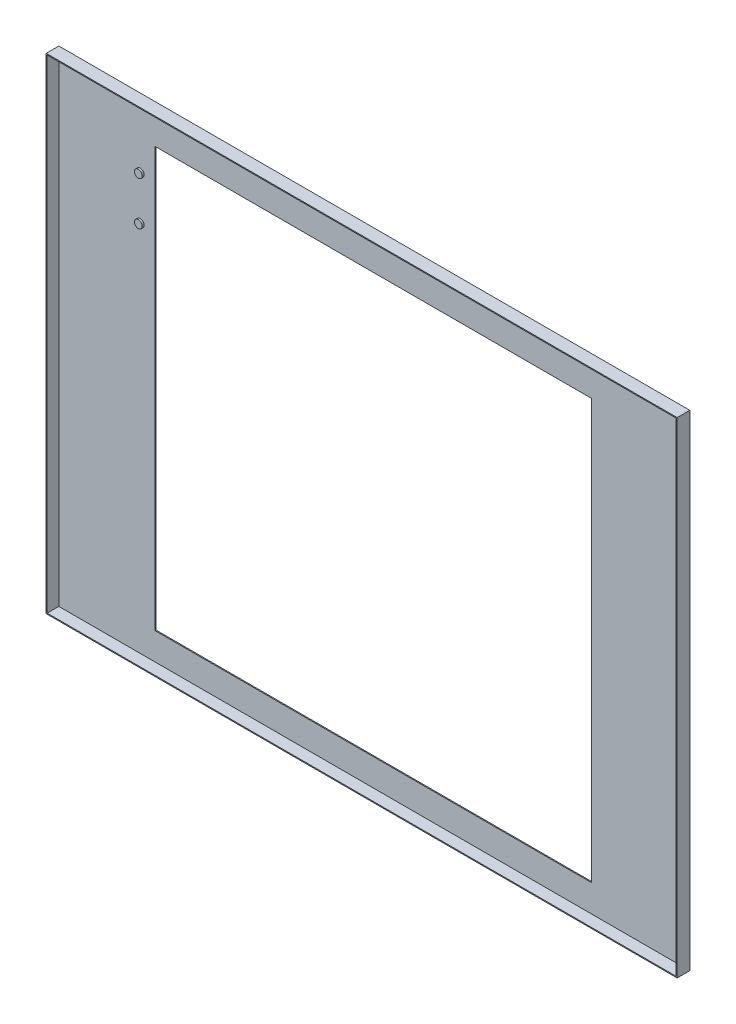
ISO-10303-21;
HEADER;
FILE_DESCRIPTION(('STEP AP214'),'2;1');
FILE_NAME('part.step','',(''),(''),'','','');
FILE_SCHEMA(('AUTOMOTIVE_DESIGN { 1 0 10303 214 1 1 1 1 }'));
ENDSEC;
DATA;
#1=APPLICATION_CONTEXT('core data for automotive mechanical design processes');
#2=APPLICATION_PROTOCOL_DEFINITION('international standard','automotive_design',2000,#1);
#3=PRODUCT_CONTEXT('',#1,'mechanical');
#4=PRODUCT('Part','Part','',(#3));
#5=PRODUCT_RELATED_PRODUCT_CATEGORY('part','',(#4));
#6=PRODUCT_DEFINITION_FORMATION('','',#4);
#7=PRODUCT_DEFINITION_CONTEXT('part definition',#1,'design');
#8=PRODUCT_DEFINITION('design','',#6,#7);
#9=PRODUCT_DEFINITION_SHAPE('','',#8);
#10=(LENGTH_UNIT() NAMED_UNIT(*) SI_UNIT(.MILLI.,.METRE.));
#11=(NAMED_UNIT(*) PLANE_ANGLE_UNIT() SI_UNIT($,.RADIAN.));
#12=(NAMED_UNIT(*) SI_UNIT($,.STERADIAN.) SOLID_ANGLE_UNIT());
#13=UNCERTAINTY_MEASURE_WITH_UNIT(LENGTH_MEASURE(1.E-05),#10,'distance_accuracy_value','');
#14=(GEOMETRIC_REPRESENTATION_CONTEXT(3) GLOBAL_UNCERTAINTY_ASSIGNED_CONTEXT((#13)) GLOBAL_UNIT_ASSIGNED_CONTEXT((#10,
#11,#12)) REPRESENTATION_CONTEXT('',''));
#15=CARTESIAN_POINT('',(0.,0.,0.));
#16=DIRECTION('',(0.,0.,1.));
#17=DIRECTION('',(1.,0.,0.));
#18=AXIS2_PLACEMENT_3D('',#15,#16,#17);
#19=CARTESIAN_POINT('',(-225.,-211.,13.));
#20=DIRECTION('',(1.,0.,0.));
#21=DIRECTION('',(0.,0.,-1.));
#22=AXIS2_PLACEMENT_3D('',#19,#20,#21);
#23=PLANE('',#22);
#24=DIRECTION('',(0.,0.,-1.));
#25=VECTOR('',#24,1.);
#26=CARTESIAN_POINT('',(-225.,211.,13.));
#27=LINE('',#26,#25);
#28=CARTESIAN_POINT('',(-225.,211.,0.999999999999999));
#29=VERTEX_POINT('',#28);
#30=CARTESIAN_POINT('',(-225.,211.,0.));
#31=VERTEX_POINT('',#30);
#32=EDGE_CURVE('E188',#29,#31,#27,.T.);
#33=ORIENTED_EDGE('',*,*,#32,.F.);
#34=DIRECTION('',(0.,-1.,0.));
#35=VECTOR('',#34,1.);
#36=CARTESIAN_POINT('',(-225.,-211.,0.999999999999999));
#37=LINE('',#36,#35);
#38=CARTESIAN_POINT('',(-225.,-221.,1.));
#39=VERTEX_POINT('',#38);
#40=EDGE_CURVE('E160',#29,#39,#37,.T.);
#41=ORIENTED_EDGE('',*,*,#40,.T.);
#42=DIRECTION('',(0.,0.,-1.));
#43=VECTOR('',#42,1.);
#44=CARTESIAN_POINT('',(-225.,-221.,463.111097397076));
#45=LINE('',#44,#43);
#46=CARTESIAN_POINT('',(-225.,-221.,0.));
#47=VERTEX_POINT('',#46);
#48=EDGE_CURVE('E175',#39,#47,#45,.T.);
#49=ORIENTED_EDGE('',*,*,#48,.T.);
#50=DIRECTION('',(0.,-1.,0.));
#51=VECTOR('',#50,1.);
#52=CARTESIAN_POINT('',(-225.,-211.,0.));
#53=LINE('',#52,#51);
#54=EDGE_CURVE('E179',#31,#47,#53,.T.);
#55=ORIENTED_EDGE('',*,*,#54,.F.);
#56=EDGE_LOOP('',(#33,#41,#49,#55));
#57=FACE_BOUND('',#56,.T.);
#58=ADVANCED_FACE('F33',(#57),#23,.T.);
#59=CARTESIAN_POINT('',(225.,-211.,13.));
#60=DIRECTION('',(-1.,0.,0.));
#61=DIRECTION('',(0.,0.,1.));
#62=AXIS2_PLACEMENT_3D('',#59,#60,#61);
#63=PLANE('',#62);
#64=DIRECTION('',(0.,0.,-1.));
#65=VECTOR('',#64,1.);
#66=CARTESIAN_POINT('',(225.,-221.,463.111097397076));
#67=LINE('',#66,#65);
#68=CARTESIAN_POINT('',(225.,-221.,1.));
#69=VERTEX_POINT('',#68);
#70=CARTESIAN_POINT('',(225.,-221.,0.));
#71=VERTEX_POINT('',#70);
#72=EDGE_CURVE('E177',#69,#71,#67,.T.);
#73=ORIENTED_EDGE('',*,*,#72,.F.);
#74=DIRECTION('',(0.,1.,0.));
#75=VECTOR('',#74,1.);
#76=CARTESIAN_POINT('',(225.,-211.,0.999999999999999));
#77=LINE('',#76,#75);
#78=CARTESIAN_POINT('',(225.,211.,0.999999999999999));
#79=VERTEX_POINT('',#78);
#80=EDGE_CURVE('E56',#69,#79,#77,.T.);
#81=ORIENTED_EDGE('',*,*,#80,.T.);
#82=DIRECTION('',(0.,0.,-1.));
#83=VECTOR('',#82,1.);
#84=CARTESIAN_POINT('',(225.,211.,13.));
#85=LINE('',#84,#83);
#86=CARTESIAN_POINT('',(225.,211.,0.));
#87=VERTEX_POINT('',#86);
#88=EDGE_CURVE('E190',#79,#87,#85,.T.);
#89=ORIENTED_EDGE('',*,*,#88,.T.);
#90=DIRECTION('',(0.,1.,0.));
#91=VECTOR('',#90,1.);
#92=CARTESIAN_POINT('',(225.,-211.,0.));
#93=LINE('',#92,#91);
#94=EDGE_CURVE('E182',#71,#87,#93,.T.);
#95=ORIENTED_EDGE('',*,*,#94,.F.);
#96=EDGE_LOOP('',(#73,#81,#89,#95));
#97=FACE_BOUND('',#96,.T.);
#98=ADVANCED_FACE('F245',(#97),#63,.T.);
#99=CARTESIAN_POINT('',(225.,211.,13.));
#100=DIRECTION('',(0.,-1.,0.));
#101=DIRECTION('',(1.,0.,0.));
#102=AXIS2_PLACEMENT_3D('',#99,#100,#101);
#103=PLANE('',#102);
#104=ORIENTED_EDGE('',*,*,#88,.F.);
#105=DIRECTION('',(-1.,0.,0.));
#106=VECTOR('',#105,1.);
#107=CARTESIAN_POINT('',(225.,211.,0.999999999999999));
#108=LINE('',#107,#106);
#109=EDGE_CURVE('E144',#79,#29,#108,.T.);
#110=ORIENTED_EDGE('',*,*,#109,.T.);
#111=ORIENTED_EDGE('',*,*,#32,.T.);
#112=DIRECTION('',(-1.,0.,0.));
#113=VECTOR('',#112,1.);
#114=CARTESIAN_POINT('',(225.,211.,0.));
#115=LINE('',#114,#113);
#116=EDGE_CURVE('E185',#87,#31,#115,.T.);
#117=ORIENTED_EDGE('',*,*,#116,.F.);
#118=EDGE_LOOP('',(#104,#110,#111,#117));
#119=FACE_BOUND('',#118,.T.);
#120=ADVANCED_FACE('F251',(#119),#103,.T.);
#121=CARTESIAN_POINT('',(225.,-221.,463.111097397076));
#122=DIRECTION('',(0.,-1.,0.));
#123=DIRECTION('',(0.,0.,-1.));
#124=AXIS2_PLACEMENT_3D('',#121,#122,#123);
#125=PLANE('',#124);
#126=DIRECTION('',(-1.,0.,0.));
#127=VECTOR('',#126,1.);
#128=CARTESIAN_POINT('',(225.,-221.,1.));
#129=LINE('',#128,#127);
#130=EDGE_CURVE('E162',#69,#39,#129,.T.);
#131=ORIENTED_EDGE('',*,*,#130,.F.);
#132=ORIENTED_EDGE('',*,*,#72,.T.);
#133=DIRECTION('',(-1.,0.,0.));
#134=VECTOR('',#133,1.);
#135=CARTESIAN_POINT('',(225.,-221.,0.));
#136=LINE('',#135,#134);
#137=EDGE_CURVE('E154',#71,#47,#136,.T.);
#138=ORIENTED_EDGE('',*,*,#137,.T.);
#139=ORIENTED_EDGE('',*,*,#48,.F.);
#140=EDGE_LOOP('',(#131,#132,#138,#139));
#141=FACE_BOUND('',#140,.T.);
#142=ADVANCED_FACE('F259',(#141),#125,.F.);
#143=CARTESIAN_POINT('',(0.,0.,13.));
#144=DIRECTION('',(0.,0.,1.));
#145=DIRECTION('',(1.,0.,0.));
#146=AXIS2_PLACEMENT_3D('',#143,#144,#145);
#147=PLANE('',#146);
#148=DIRECTION('',(0.,-1.,0.));
#149=VECTOR('',#148,1.);
#150=CARTESIAN_POINT('',(-324.,-250.,13.));
#151=LINE('',#150,#149);
#152=CARTESIAN_POINT('',(-324.,249.,13.));
#153=VERTEX_POINT('',#152);
#154=CARTESIAN_POINT('',(-324.,-249.,13.));
#155=VERTEX_POINT('',#154);
#156=EDGE_CURVE('E129',#153,#155,#151,.T.);
#157=ORIENTED_EDGE('',*,*,#156,.F.);
#158=DIRECTION('',(-1.,0.,0.));
#159=VECTOR('',#158,1.);
#160=CARTESIAN_POINT('',(325.,249.,13.));
#161=LINE('',#160,#159);
#162=CARTESIAN_POINT('',(324.,249.,13.));
#163=VERTEX_POINT('',#162);
#164=EDGE_CURVE('E135',#163,#153,#161,.T.);
#165=ORIENTED_EDGE('',*,*,#164,.F.);
#166=DIRECTION('',(0.,1.,0.));
#167=VECTOR('',#166,1.);
#168=CARTESIAN_POINT('',(324.,-250.,13.));
#169=LINE('',#168,#167);
#170=CARTESIAN_POINT('',(324.,-249.,13.));
#171=VERTEX_POINT('',#170);
#172=EDGE_CURVE('E170',#171,#163,#169,.T.);
#173=ORIENTED_EDGE('',*,*,#172,.F.);
#174=DIRECTION('',(1.,0.,0.));
#175=VECTOR('',#174,1.);
#176=CARTESIAN_POINT('',(325.,-249.,13.));
#177=LINE('',#176,#175);
#178=EDGE_CURVE('E168',#155,#171,#177,.T.);
#179=ORIENTED_EDGE('',*,*,#178,.F.);
#180=EDGE_LOOP('',(#157,#165,#173,#179));
#181=FACE_BOUND('',#180,.T.);
#182=DIRECTION('',(0.,-1.,0.));
#183=VECTOR('',#182,1.);
#184=CARTESIAN_POINT('',(-325.,-250.,13.));
#185=LINE('',#184,#183);
#186=CARTESIAN_POINT('',(-325.,250.,13.));
#187=VERTEX_POINT('',#186);
#188=CARTESIAN_POINT('',(-325.,-250.,13.));
#189=VERTEX_POINT('',#188);
#190=EDGE_CURVE('E193',#187,#189,#185,.T.);
#191=ORIENTED_EDGE('',*,*,#190,.T.);
#192=DIRECTION('',(1.,0.,0.));
#193=VECTOR('',#192,1.);
#194=CARTESIAN_POINT('',(325.,-250.,13.));
#195=LINE('',#194,#193);
#196=CARTESIAN_POINT('',(325.,-250.,13.));
#197=VERTEX_POINT('',#196);
#198=EDGE_CURVE('E196',#189,#197,#195,.T.);
#199=ORIENTED_EDGE('',*,*,#198,.T.);
#200=DIRECTION('',(0.,1.,0.));
#201=VECTOR('',#200,1.);
#202=CARTESIAN_POINT('',(325.,-250.,13.));
#203=LINE('',#202,#201);
#204=CARTESIAN_POINT('',(325.,250.,13.));
#205=VERTEX_POINT('',#204);
#206=EDGE_CURVE('E199',#197,#205,#203,.T.);
#207=ORIENTED_EDGE('',*,*,#206,.T.);
#208=DIRECTION('',(-1.,0.,0.));
#209=VECTOR('',#208,1.);
#210=CARTESIAN_POINT('',(325.,250.,13.));
#211=LINE('',#210,#209);
#212=EDGE_CURVE('E201',#205,#187,#211,.T.);
#213=ORIENTED_EDGE('',*,*,#212,.T.);
#214=EDGE_LOOP('',(#191,#199,#207,#213));
#215=FACE_BOUND('',#214,.T.);
#216=ADVANCED_FACE('F236',(#181,#215),#147,.T.);
#217=CARTESIAN_POINT('',(0.,0.,0.));
#218=DIRECTION('',(0.,0.,1.));
#219=DIRECTION('',(1.,0.,0.));
#220=AXIS2_PLACEMENT_3D('',#217,#218,#219);
#221=PLANE('',#220);
#222=DIRECTION('',(0.,-1.,0.));
#223=VECTOR('',#222,1.);
#224=CARTESIAN_POINT('',(-325.,-250.,0.));
#225=LINE('',#224,#223);
#226=CARTESIAN_POINT('',(-325.,250.,0.));
#227=VERTEX_POINT('',#226);
#228=CARTESIAN_POINT('',(-325.,-250.,0.));
#229=VERTEX_POINT('',#228);
#230=EDGE_CURVE('E192',#227,#229,#225,.T.);
#231=ORIENTED_EDGE('',*,*,#230,.F.);
#232=DIRECTION('',(-1.,0.,0.));
#233=VECTOR('',#232,1.);
#234=CARTESIAN_POINT('',(325.,250.,0.));
#235=LINE('',#234,#233);
#236=CARTESIAN_POINT('',(325.,250.,0.));
#237=VERTEX_POINT('',#236);
#238=EDGE_CURVE('E197',#237,#227,#235,.T.);
#239=ORIENTED_EDGE('',*,*,#238,.F.);
#240=DIRECTION('',(0.,1.,0.));
#241=VECTOR('',#240,1.);
#242=CARTESIAN_POINT('',(325.,-250.,0.));
#243=LINE('',#242,#241);
#244=CARTESIAN_POINT('',(325.,-250.,0.));
#245=VERTEX_POINT('',#244);
#246=EDGE_CURVE('E208',#245,#237,#243,.T.);
#247=ORIENTED_EDGE('',*,*,#246,.F.);
#248=DIRECTION('',(1.,0.,0.));
#249=VECTOR('',#248,1.);
#250=CARTESIAN_POINT('',(325.,-250.,0.));
#251=LINE('',#250,#249);
#252=EDGE_CURVE('E206',#229,#245,#251,.T.);
#253=ORIENTED_EDGE('',*,*,#252,.F.);
#254=EDGE_LOOP('',(#231,#239,#247,#253));
#255=FACE_BOUND('',#254,.T.);
#256=ORIENTED_EDGE('',*,*,#54,.T.);
#257=ORIENTED_EDGE('',*,*,#137,.F.);
#258=ORIENTED_EDGE('',*,*,#94,.T.);
#259=ORIENTED_EDGE('',*,*,#116,.T.);
#260=EDGE_LOOP('',(#256,#257,#258,#259));
#261=FACE_BOUND('',#260,.T.);
#262=ADVANCED_FACE('F226',(#255,#261),#221,.F.);
#263=CARTESIAN_POINT('',(-325.,-250.,13.));
#264=DIRECTION('',(1.,0.,0.));
#265=DIRECTION('',(0.,0.,-1.));
#266=AXIS2_PLACEMENT_3D('',#263,#264,#265);
#267=PLANE('',#266);
#268=ORIENTED_EDGE('',*,*,#230,.T.);
#269=DIRECTION('',(0.,0.,-1.));
#270=VECTOR('',#269,1.);
#271=CARTESIAN_POINT('',(-325.,-250.,13.));
#272=LINE('',#271,#270);
#273=EDGE_CURVE('E11',#189,#229,#272,.T.);
#274=ORIENTED_EDGE('',*,*,#273,.F.);
#275=ORIENTED_EDGE('',*,*,#190,.F.);
#276=DIRECTION('',(0.,0.,-1.));
#277=VECTOR('',#276,1.);
#278=CARTESIAN_POINT('',(-325.,250.,13.));
#279=LINE('',#278,#277);
#280=EDGE_CURVE('E203',#187,#227,#279,.T.);
#281=ORIENTED_EDGE('',*,*,#280,.T.);
#282=EDGE_LOOP('',(#268,#274,#275,#281));
#283=FACE_BOUND('',#282,.T.);
#284=ADVANCED_FACE('F35',(#283),#267,.F.);
#285=CARTESIAN_POINT('',(325.,-250.,13.));
#286=DIRECTION('',(0.,1.,0.));
#287=DIRECTION('',(-1.,0.,0.));
#288=AXIS2_PLACEMENT_3D('',#285,#286,#287);
#289=PLANE('',#288);
#290=ORIENTED_EDGE('',*,*,#252,.T.);
#291=DIRECTION('',(0.,0.,-1.));
#292=VECTOR('',#291,1.);
#293=CARTESIAN_POINT('',(325.,-250.,13.));
#294=LINE('',#293,#292);
#295=EDGE_CURVE('E41',#197,#245,#294,.T.);
#296=ORIENTED_EDGE('',*,*,#295,.F.);
#297=ORIENTED_EDGE('',*,*,#198,.F.);
#298=ORIENTED_EDGE('',*,*,#273,.T.);
#299=EDGE_LOOP('',(#290,#296,#297,#298));
#300=FACE_BOUND('',#299,.T.);
#301=ADVANCED_FACE('F237',(#300),#289,.F.);
#302=CARTESIAN_POINT('',(325.,-250.,13.));
#303=DIRECTION('',(-1.,0.,0.));
#304=DIRECTION('',(0.,0.,1.));
#305=AXIS2_PLACEMENT_3D('',#302,#303,#304);
#306=PLANE('',#305);
#307=ORIENTED_EDGE('',*,*,#246,.T.);
#308=DIRECTION('',(0.,0.,-1.));
#309=VECTOR('',#308,1.);
#310=CARTESIAN_POINT('',(325.,250.,13.));
#311=LINE('',#310,#309);
#312=EDGE_CURVE('E213',#205,#237,#311,.T.);
#313=ORIENTED_EDGE('',*,*,#312,.F.);
#314=ORIENTED_EDGE('',*,*,#206,.F.);
#315=ORIENTED_EDGE('',*,*,#295,.T.);
#316=EDGE_LOOP('',(#307,#313,#314,#315));
#317=FACE_BOUND('',#316,.T.);
#318=ADVANCED_FACE('F220',(#317),#306,.F.);
#319=CARTESIAN_POINT('',(325.,250.,13.));
#320=DIRECTION('',(0.,-1.,0.));
#321=DIRECTION('',(1.,0.,0.));
#322=AXIS2_PLACEMENT_3D('',#319,#320,#321);
#323=PLANE('',#322);
#324=ORIENTED_EDGE('',*,*,#238,.T.);
#325=ORIENTED_EDGE('',*,*,#280,.F.);
#326=ORIENTED_EDGE('',*,*,#212,.F.);
#327=ORIENTED_EDGE('',*,*,#312,.T.);
#328=EDGE_LOOP('',(#324,#325,#326,#327));
#329=FACE_BOUND('',#328,.T.);
#330=ADVANCED_FACE('F230',(#329),#323,.F.);
#331=CARTESIAN_POINT('',(0.,0.,1.));
#332=DIRECTION('',(0.,0.,1.));
#333=DIRECTION('',(1.,0.,0.));
#334=AXIS2_PLACEMENT_3D('',#331,#332,#333);
#335=PLANE('',#334);
#336=CARTESIAN_POINT('',(-240.106920593987,135.000000000019,1.));
#337=DIRECTION('',(0.,0.,1.));
#338=DIRECTION('',(1.,0.,0.));
#339=AXIS2_PLACEMENT_3D('',#336,#337,#338);
#340=CIRCLE('',#339,3.99999999999999);
#341=CARTESIAN_POINT('',(-236.106920593987,135.000000000019,1.));
#342=VERTEX_POINT('',#341);
#343=EDGE_CURVE('E424',#342,#342,#340,.T.);
#344=ORIENTED_EDGE('',*,*,#343,.F.);
#345=EDGE_LOOP('',(#344));
#346=FACE_BOUND('',#345,.T.);
#347=CARTESIAN_POINT('',(-240.106920593987,180.000000000019,1.));
#348=DIRECTION('',(0.,0.,1.));
#349=DIRECTION('',(1.,0.,0.));
#350=AXIS2_PLACEMENT_3D('',#347,#348,#349);
#351=CIRCLE('',#350,3.99999999999999);
#352=CARTESIAN_POINT('',(-236.106920593987,180.000000000019,1.));
#353=VERTEX_POINT('',#352);
#354=EDGE_CURVE('E150',#353,#353,#351,.T.);
#355=ORIENTED_EDGE('',*,*,#354,.F.);
#356=EDGE_LOOP('',(#355));
#357=FACE_BOUND('',#356,.T.);
#358=DIRECTION('',(0.,-1.,0.));
#359=VECTOR('',#358,1.);
#360=CARTESIAN_POINT('',(-324.,-250.,0.999999999999999));
#361=LINE('',#360,#359);
#362=CARTESIAN_POINT('',(-324.,249.,1.));
#363=VERTEX_POINT('',#362);
#364=CARTESIAN_POINT('',(-324.,-249.,1.));
#365=VERTEX_POINT('',#364);
#366=EDGE_CURVE('E126',#363,#365,#361,.T.);
#367=ORIENTED_EDGE('',*,*,#366,.T.);
#368=DIRECTION('',(1.,0.,0.));
#369=VECTOR('',#368,1.);
#370=CARTESIAN_POINT('',(325.,-249.,0.999999999999999));
#371=LINE('',#370,#369);
#372=CARTESIAN_POINT('',(324.,-249.,1.));
#373=VERTEX_POINT('',#372);
#374=EDGE_CURVE('E143',#365,#373,#371,.T.);
#375=ORIENTED_EDGE('',*,*,#374,.T.);
#376=DIRECTION('',(0.,1.,0.));
#377=VECTOR('',#376,1.);
#378=CARTESIAN_POINT('',(324.,-250.,0.999999999999999));
#379=LINE('',#378,#377);
#380=CARTESIAN_POINT('',(324.,249.,1.));
#381=VERTEX_POINT('',#380);
#382=EDGE_CURVE('E128',#373,#381,#379,.T.);
#383=ORIENTED_EDGE('',*,*,#382,.T.);
#384=DIRECTION('',(-1.,0.,0.));
#385=VECTOR('',#384,1.);
#386=CARTESIAN_POINT('',(325.,249.,0.999999999999999));
#387=LINE('',#386,#385);
#388=EDGE_CURVE('E122',#381,#363,#387,.T.);
#389=ORIENTED_EDGE('',*,*,#388,.T.);
#390=EDGE_LOOP('',(#367,#375,#383,#389));
#391=FACE_BOUND('',#390,.T.);
#392=ORIENTED_EDGE('',*,*,#40,.F.);
#393=ORIENTED_EDGE('',*,*,#109,.F.);
#394=ORIENTED_EDGE('',*,*,#80,.F.);
#395=ORIENTED_EDGE('',*,*,#130,.T.);
#396=EDGE_LOOP('',(#392,#393,#394,#395));
#397=FACE_BOUND('',#396,.T.);
#398=ADVANCED_FACE('F124',(#346,#357,#391,#397),#335,.T.);
#399=CARTESIAN_POINT('',(-324.,-250.,13.));
#400=DIRECTION('',(1.,0.,0.));
#401=DIRECTION('',(0.,0.,-1.));
#402=AXIS2_PLACEMENT_3D('',#399,#400,#401);
#403=PLANE('',#402);
#404=ORIENTED_EDGE('',*,*,#366,.F.);
#405=DIRECTION('',(0.,0.,-1.));
#406=VECTOR('',#405,1.);
#407=CARTESIAN_POINT('',(-324.,249.,13.));
#408=LINE('',#407,#406);
#409=EDGE_CURVE('E132',#153,#363,#408,.T.);
#410=ORIENTED_EDGE('',*,*,#409,.F.);
#411=ORIENTED_EDGE('',*,*,#156,.T.);
#412=DIRECTION('',(0.,0.,-1.));
#413=VECTOR('',#412,1.);
#414=CARTESIAN_POINT('',(-324.,-249.,13.));
#415=LINE('',#414,#413);
#416=EDGE_CURVE('E142',#155,#365,#415,.T.);
#417=ORIENTED_EDGE('',*,*,#416,.T.);
#418=EDGE_LOOP('',(#404,#410,#411,#417));
#419=FACE_BOUND('',#418,.T.);
#420=ADVANCED_FACE('F140',(#419),#403,.T.);
#421=CARTESIAN_POINT('',(325.,-249.,13.));
#422=DIRECTION('',(0.,1.,0.));
#423=DIRECTION('',(-1.,0.,0.));
#424=AXIS2_PLACEMENT_3D('',#421,#422,#423);
#425=PLANE('',#424);
#426=ORIENTED_EDGE('',*,*,#374,.F.);
#427=ORIENTED_EDGE('',*,*,#416,.F.);
#428=ORIENTED_EDGE('',*,*,#178,.T.);
#429=DIRECTION('',(0.,0.,-1.));
#430=VECTOR('',#429,1.);
#431=CARTESIAN_POINT('',(324.,-249.,13.));
#432=LINE('',#431,#430);
#433=EDGE_CURVE('E155',#171,#373,#432,.T.);
#434=ORIENTED_EDGE('',*,*,#433,.T.);
#435=EDGE_LOOP('',(#426,#427,#428,#434));
#436=FACE_BOUND('',#435,.T.);
#437=ADVANCED_FACE('F274',(#436),#425,.T.);
#438=CARTESIAN_POINT('',(324.,-250.,13.));
#439=DIRECTION('',(-1.,0.,0.));
#440=DIRECTION('',(0.,0.,1.));
#441=AXIS2_PLACEMENT_3D('',#438,#439,#440);
#442=PLANE('',#441);
#443=ORIENTED_EDGE('',*,*,#382,.F.);
#444=ORIENTED_EDGE('',*,*,#433,.F.);
#445=ORIENTED_EDGE('',*,*,#172,.T.);
#446=DIRECTION('',(0.,0.,-1.));
#447=VECTOR('',#446,1.);
#448=CARTESIAN_POINT('',(324.,249.,13.));
#449=LINE('',#448,#447);
#450=EDGE_CURVE('E48',#163,#381,#449,.T.);
#451=ORIENTED_EDGE('',*,*,#450,.T.);
#452=EDGE_LOOP('',(#443,#444,#445,#451));
#453=FACE_BOUND('',#452,.T.);
#454=ADVANCED_FACE('F284',(#453),#442,.T.);
#455=CARTESIAN_POINT('',(325.,249.,13.));
#456=DIRECTION('',(0.,-1.,0.));
#457=DIRECTION('',(1.,0.,0.));
#458=AXIS2_PLACEMENT_3D('',#455,#456,#457);
#459=PLANE('',#458);
#460=ORIENTED_EDGE('',*,*,#388,.F.);
#461=ORIENTED_EDGE('',*,*,#450,.F.);
#462=ORIENTED_EDGE('',*,*,#164,.T.);
#463=ORIENTED_EDGE('',*,*,#409,.T.);
#464=EDGE_LOOP('',(#460,#461,#462,#463));
#465=FACE_BOUND('',#464,.T.);
#466=ADVANCED_FACE('F133',(#465),#459,.T.);
#467=CARTESIAN_POINT('',(-240.106920593987,180.000000000019,3.));
#468=DIRECTION('',(0.,0.,-1.));
#469=DIRECTION('',(-1.,0.,0.));
#470=AXIS2_PLACEMENT_3D('',#467,#468,#469);
#471=CYLINDRICAL_SURFACE('',#470,3.99999999999999);
#472=CARTESIAN_POINT('',(-240.106920593987,180.000000000019,3.));
#473=DIRECTION('',(0.,0.,1.));
#474=DIRECTION('',(1.,0.,0.));
#475=AXIS2_PLACEMENT_3D('',#472,#473,#474);
#476=CIRCLE('',#475,3.99999999999999);
#477=CARTESIAN_POINT('',(-236.106920593987,180.000000000019,3.));
#478=VERTEX_POINT('',#477);
#479=EDGE_CURVE('E166',#478,#478,#476,.T.);
#480=ORIENTED_EDGE('',*,*,#479,.F.);
#481=EDGE_LOOP('',(#480));
#482=FACE_BOUND('',#481,.T.);
#483=ORIENTED_EDGE('',*,*,#354,.T.);
#484=EDGE_LOOP('',(#483));
#485=FACE_BOUND('',#484,.T.);
#486=ADVANCED_FACE('F279',(#482,#485),#471,.T.);
#487=CARTESIAN_POINT('',(-240.106920593987,180.000000000019,3.));
#488=DIRECTION('',(0.,0.,1.));
#489=DIRECTION('',(1.,0.,0.));
#490=AXIS2_PLACEMENT_3D('',#487,#488,#489);
#491=PLANE('',#490);
#492=ORIENTED_EDGE('',*,*,#479,.T.);
#493=EDGE_LOOP('',(#492));
#494=FACE_BOUND('',#493,.T.);
#495=ADVANCED_FACE('F388',(#494),#491,.T.);
#496=CARTESIAN_POINT('',(-240.106920593987,135.000000000019,3.));
#497=DIRECTION('',(0.,0.,-1.));
#498=DIRECTION('',(-1.,0.,0.));
#499=AXIS2_PLACEMENT_3D('',#496,#497,#498);
#500=CYLINDRICAL_SURFACE('',#499,3.99999999999999);
#501=CARTESIAN_POINT('',(-240.106920593987,135.000000000019,3.));
#502=DIRECTION('',(0.,0.,1.));
#503=DIRECTION('',(1.,0.,0.));
#504=AXIS2_PLACEMENT_3D('',#501,#502,#503);
#505=CIRCLE('',#504,3.99999999999999);
#506=CARTESIAN_POINT('',(-236.106920593987,135.000000000019,3.));
#507=VERTEX_POINT('',#506);
#508=EDGE_CURVE('E423',#507,#507,#505,.T.);
#509=ORIENTED_EDGE('',*,*,#508,.F.);
#510=EDGE_LOOP('',(#509));
#511=FACE_BOUND('',#510,.T.);
#512=ORIENTED_EDGE('',*,*,#343,.T.);
#513=EDGE_LOOP('',(#512));
#514=FACE_BOUND('',#513,.T.);
#515=ADVANCED_FACE('F395',(#511,#514),#500,.T.);
#516=CARTESIAN_POINT('',(-240.106920593987,135.000000000019,3.));
#517=DIRECTION('',(0.,0.,1.));
#518=DIRECTION('',(1.,0.,0.));
#519=AXIS2_PLACEMENT_3D('',#516,#517,#518);
#520=PLANE('',#519);
#521=ORIENTED_EDGE('',*,*,#508,.T.);
#522=EDGE_LOOP('',(#521));
#523=FACE_BOUND('',#522,.T.);
#524=ADVANCED_FACE('F402',(#523),#520,.T.);
#525=CLOSED_SHELL('',(#58,#98,#120,#142,#216,#262,#284,#301,#318,#330,#398,#420,#437,#454,#466,
#486,#495,#515,#524));
#526=MANIFOLD_SOLID_BREP('B2',#525);
#527=ADVANCED_BREP_SHAPE_REPRESENTATION('',(#18,#526),#14);
#528=SHAPE_DEFINITION_REPRESENTATION(#9,#527);
ENDSEC;
END-ISO-10303-21;
